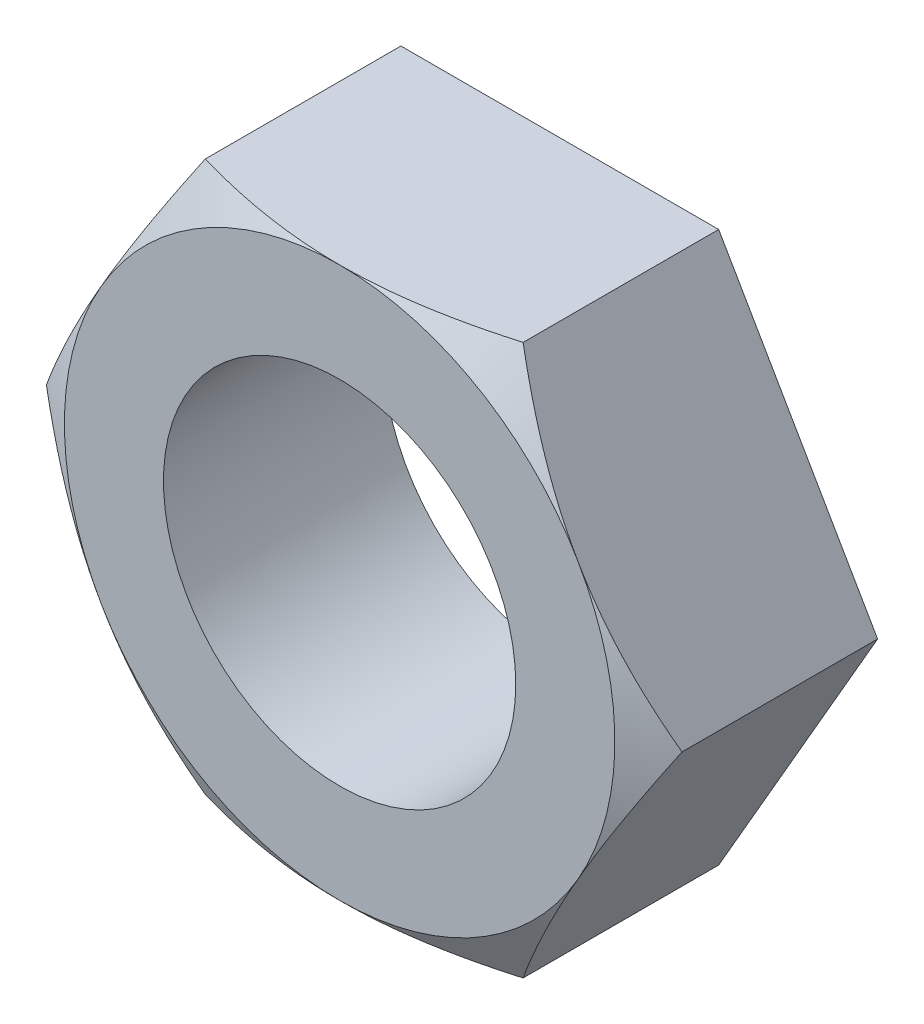
ISO-10303-21;
HEADER;
FILE_DESCRIPTION(('STEP AP214'),'2;1');
FILE_NAME('part.step','',(''),(''),'','','');
FILE_SCHEMA(('AUTOMOTIVE_DESIGN { 1 0 10303 214 1 1 1 1 }'));
ENDSEC;
DATA;
#1=APPLICATION_CONTEXT('core data for automotive mechanical design processes');
#2=APPLICATION_PROTOCOL_DEFINITION('international standard','automotive_design',2000,#1);
#3=PRODUCT_CONTEXT('',#1,'mechanical');
#4=PRODUCT('Part','Part','',(#3));
#5=PRODUCT_RELATED_PRODUCT_CATEGORY('part','',(#4));
#6=PRODUCT_DEFINITION_FORMATION('','',#4);
#7=PRODUCT_DEFINITION_CONTEXT('part definition',#1,'design');
#8=PRODUCT_DEFINITION('design','',#6,#7);
#9=PRODUCT_DEFINITION_SHAPE('','',#8);
#10=(LENGTH_UNIT() NAMED_UNIT(*) SI_UNIT(.MILLI.,.METRE.));
#11=(NAMED_UNIT(*) PLANE_ANGLE_UNIT() SI_UNIT($,.RADIAN.));
#12=(NAMED_UNIT(*) SI_UNIT($,.STERADIAN.) SOLID_ANGLE_UNIT());
#13=UNCERTAINTY_MEASURE_WITH_UNIT(LENGTH_MEASURE(1.E-05),#10,'distance_accuracy_value','');
#14=(GEOMETRIC_REPRESENTATION_CONTEXT(3) GLOBAL_UNCERTAINTY_ASSIGNED_CONTEXT((#13)) GLOBAL_UNIT_ASSIGNED_CONTEXT((#10,
#11,#12)) REPRESENTATION_CONTEXT('',''));
#15=CARTESIAN_POINT('',(0.,0.,0.));
#16=DIRECTION('',(0.,0.,1.));
#17=DIRECTION('',(1.,0.,0.));
#18=AXIS2_PLACEMENT_3D('',#15,#16,#17);
#19=CARTESIAN_POINT('',(7.21687836487047,-12.4999999999999,10.));
#20=DIRECTION('',(-0.866025403784441,0.499999999999995,0.));
#21=DIRECTION('',(-0.499999999999995,-0.866025403784441,0.));
#22=AXIS2_PLACEMENT_3D('',#19,#20,#21);
#23=PLANE('',#22);
#24=CARTESIAN_POINT('',(7.21676289481663,-12.5001999999999,8.88347836407037));
#25=CARTESIAN_POINT('',(7.37538720676169,-12.2254546323954,8.97505452339791));
#26=CARTESIAN_POINT('',(7.53463023886579,-11.9496376100398,9.06247516136619));
#27=CARTESIAN_POINT('',(7.85439324689781,-11.3957918337473,9.22785029648819));
#28=CARTESIAN_POINT('',(8.01491362441963,-11.1177623842294,9.30580168024974));
#29=CARTESIAN_POINT('',(8.33754155397065,-10.5589544183062,9.45119048700357));
#30=CARTESIAN_POINT('',(8.49965192926075,-10.2781710118697,9.51860303339904));
#31=CARTESIAN_POINT('',(8.82499915663675,-9.7146530839528,9.64146662159215));
#32=CARTESIAN_POINT('',(8.98823594390972,-9.43191867473171,9.69691834578119));
#33=CARTESIAN_POINT('',(9.31165322870549,-8.87174350541945,9.79350173205536));
#34=CARTESIAN_POINT('',(9.47180971512836,-8.59434433377331,9.83495306623979));
#35=CARTESIAN_POINT('',(9.79285656486178,-8.03827487842509,9.90445793985331));
#36=CARTESIAN_POINT('',(9.95374694223766,-7.75960457036115,9.93251122140478));
#37=CARTESIAN_POINT('',(10.2757979783547,-7.20179581317628,9.97451166013351));
#38=CARTESIAN_POINT('',(10.4369580868775,-6.92265831706134,9.98847557991425));
#39=CARTESIAN_POINT('',(10.7594270802745,-6.36412563663214,10.0019969897623));
#40=CARTESIAN_POINT('',(10.9207359603978,-6.08473046054666,10.0015549249596));
#41=CARTESIAN_POINT('',(11.2223029665878,-5.56240108393914,9.98727051925022));
#42=CARTESIAN_POINT('',(11.362582581157,-5.319429664239,9.9751705323715));
#43=CARTESIAN_POINT('',(11.642819136161,-4.8340457128341,9.94030381034694));
#44=CARTESIAN_POINT('',(11.7827760530676,-4.59163322188117,9.91753632069198));
#45=CARTESIAN_POINT('',(12.0622911922356,-4.10749879935742,9.86173156560465));
#46=CARTESIAN_POINT('',(12.2018489887703,-3.86577760516694,9.8286858180011));
#47=CARTESIAN_POINT('',(12.4803103038966,-3.38346845942574,9.75290433749108));
#48=CARTESIAN_POINT('',(12.6192137773526,-3.14288058605225,9.71016794582646));
#49=CARTESIAN_POINT('',(13.0408630466772,-2.41256262860773,9.56634247770938));
#50=CARTESIAN_POINT('',(13.3223878040513,-1.92494744524722,9.45091239646002));
#51=CARTESIAN_POINT('',(13.8812393974114,-0.956988091656618,9.18893319969111));
#52=CARTESIAN_POINT('',(14.1585733887867,-0.476631527928807,9.04244561244878));
#53=CARTESIAN_POINT('',(14.4338721997945,0.000199999999999989,8.88347836407037));
#54=B_SPLINE_CURVE_WITH_KNOTS('',3,(#24,#25,#26,#27,#28,#29,#30,#31,#32,#33,#34,#35,#36,#37,#38,
#39,#40,#41,#42,#43,#44,#45,#46,#47,#48,#49,#50,#51,#52,#53),.UNSPECIFIED.,.F.,.F.,(4,2,2,2,2,2,
2,2,2,2,2,2,2,2,4),(0.,0.990629746049023,1.9815843243025,2.97484380692451,3.96804660689563,
4.93673469695275,5.90544143098089,6.87299429712455,7.84051726691999,8.68277430917982,
9.52509093301095,10.3681045344908,11.2111754601961,12.9343924021276,14.6542268428617),.UNSPECIFIED.);
#55=CARTESIAN_POINT('',(7.21687836487052,-12.4999999999999,8.88354503153706));
#56=VERTEX_POINT('',#55);
#57=CARTESIAN_POINT('',(10.8253175473056,-6.24999999999998,10.));
#58=VERTEX_POINT('',#57);
#59=EDGE_CURVE('E228',#56,#58,#54,.T.);
#60=ORIENTED_EDGE('',*,*,#59,.F.);
#61=DIRECTION('',(0.,0.,-1.));
#62=VECTOR('',#61,1.);
#63=CARTESIAN_POINT('',(7.21687836487047,-12.4999999999999,10.));
#64=LINE('',#63,#62);
#65=CARTESIAN_POINT('',(7.21687836487047,-12.4999999999999,0.));
#66=VERTEX_POINT('',#65);
#67=EDGE_CURVE('E231',#56,#66,#64,.T.);
#68=ORIENTED_EDGE('',*,*,#67,.T.);
#69=DIRECTION('',(0.499999999999995,0.866025403784441,0.));
#70=VECTOR('',#69,1.);
#71=CARTESIAN_POINT('',(7.21687836487047,-12.4999999999999,0.));
#72=LINE('',#71,#70);
#73=CARTESIAN_POINT('',(14.4337567297407,0.,0.));
#74=VERTEX_POINT('',#73);
#75=EDGE_CURVE('E289',#66,#74,#72,.T.);
#76=ORIENTED_EDGE('',*,*,#75,.T.);
#77=DIRECTION('',(0.,0.,-1.));
#78=VECTOR('',#77,1.);
#79=CARTESIAN_POINT('',(14.4337567297407,0.,10.));
#80=LINE('',#79,#78);
#81=CARTESIAN_POINT('',(14.4337567297407,0.,8.88354503153703));
#82=VERTEX_POINT('',#81);
#83=EDGE_CURVE('E259',#82,#74,#80,.T.);
#84=ORIENTED_EDGE('',*,*,#83,.F.);
#85=EDGE_CURVE('E180',#58,#82,#54,.T.);
#86=ORIENTED_EDGE('',*,*,#85,.F.);
#87=EDGE_LOOP('',(#60,#68,#76,#84,#86));
#88=FACE_BOUND('',#87,.T.);
#89=ADVANCED_FACE('F46',(#88),#23,.F.);
#90=CARTESIAN_POINT('',(14.4337567297407,0.,10.));
#91=DIRECTION('',(-0.866025403784438,-0.500000000000001,0.));
#92=DIRECTION('',(0.500000000000001,-0.866025403784438,0.));
#93=AXIS2_PLACEMENT_3D('',#90,#91,#92);
#94=PLANE('',#93);
#95=CARTESIAN_POINT('',(14.4338721997945,-0.0002,8.88347836407037));
#96=CARTESIAN_POINT('',(14.2752478878494,0.274545367604498,8.97505452339791));
#97=CARTESIAN_POINT('',(14.1160048557453,0.550362389960127,9.06247516136619));
#98=CARTESIAN_POINT('',(13.7962418477133,1.10420816625264,9.2278502964882));
#99=CARTESIAN_POINT('',(13.6357214701915,1.38223761577056,9.30580168024975));
#100=CARTESIAN_POINT('',(13.3130935406405,1.9410455816937,9.45119048700358));
#101=CARTESIAN_POINT('',(13.1509831653504,2.2218289881302,9.51860303339905));
#102=CARTESIAN_POINT('',(12.8256359379744,2.78534691604711,9.64146662159216));
#103=CARTESIAN_POINT('',(12.6623991507014,3.0680813252682,9.6969183457812));
#104=CARTESIAN_POINT('',(12.3389818659056,3.62825649458046,9.79350173205538));
#105=CARTESIAN_POINT('',(12.1788253794827,3.90565566622659,9.83495306623981));
#106=CARTESIAN_POINT('',(11.8577785297493,4.46172512157481,9.90445793985333));
#107=CARTESIAN_POINT('',(11.6968881523734,4.74039542963875,9.9325112214048));
#108=CARTESIAN_POINT('',(11.3748371162564,5.29820418682362,9.97451166013354));
#109=CARTESIAN_POINT('',(11.2136770077336,5.57734168293856,9.98847557991428));
#110=CARTESIAN_POINT('',(10.8912080143365,6.13587436336776,10.0019969897623));
#111=CARTESIAN_POINT('',(10.7298991342133,6.41526953945323,10.0015549249596));
#112=CARTESIAN_POINT('',(10.4283321280233,6.93759891606076,9.98727051925026));
#113=CARTESIAN_POINT('',(10.288052513454,7.18057033576091,9.97517053237153));
#114=CARTESIAN_POINT('',(10.0078159584501,7.66595428716582,9.94030381034697));
#115=CARTESIAN_POINT('',(9.86785904154349,7.90836677811876,9.91753632069202));
#116=CARTESIAN_POINT('',(9.58834390237543,8.39250120064252,9.86173156560469));
#117=CARTESIAN_POINT('',(9.44878610584072,8.63422239483299,9.82868581800113));
#118=CARTESIAN_POINT('',(9.17032479071441,9.11653154057421,9.75290433749112));
#119=CARTESIAN_POINT('',(9.03142131725846,9.3571194139477,9.71016794582649));
#120=CARTESIAN_POINT('',(8.60977204793384,10.0874373713922,9.5663424777094));
#121=CARTESIAN_POINT('',(8.32824729055969,10.5750525547528,9.45091239646004));
#122=CARTESIAN_POINT('',(7.76939569719953,11.5430119083434,9.18893319969112));
#123=CARTESIAN_POINT('',(7.49206170582426,12.0233684720712,9.04244561244878));
#124=CARTESIAN_POINT('',(7.21676289481646,12.5002,8.88347836407037));
#125=B_SPLINE_CURVE_WITH_KNOTS('',3,(#95,#96,#97,#98,#99,#100,#101,#102,#103,#104,#105,#106,
#107,#108,#109,#110,#111,#112,#113,#114,#115,#116,#117,#118,#119,#120,#121,#122,#123,#124),
.UNSPECIFIED.,.F.,.F.,(4,2,2,2,2,2,2,2,2,2,2,2,2,2,4),(0.,0.990629746049023,1.9815843243025,
2.97484380692451,3.96804660689564,4.93673469695275,5.90544143098089,6.87299429712455,
7.84051726691999,8.68277430917984,9.52509093301099,10.3681045344909,11.2111754601961,
12.9343924021277,14.6542268428618),.UNSPECIFIED.);
#126=CARTESIAN_POINT('',(10.8253175473055,6.25000000000005,10.));
#127=VERTEX_POINT('',#126);
#128=EDGE_CURVE('E305',#82,#127,#125,.T.);
#129=ORIENTED_EDGE('',*,*,#128,.F.);
#130=ORIENTED_EDGE('',*,*,#83,.T.);
#131=DIRECTION('',(-0.500000000000001,0.866025403784438,0.));
#132=VECTOR('',#131,1.);
#133=CARTESIAN_POINT('',(14.4337567297407,0.,0.));
#134=LINE('',#133,#132);
#135=CARTESIAN_POINT('',(7.2168783648703,12.5,0.));
#136=VERTEX_POINT('',#135);
#137=EDGE_CURVE('E291',#74,#136,#134,.T.);
#138=ORIENTED_EDGE('',*,*,#137,.T.);
#139=DIRECTION('',(0.,0.,-1.));
#140=VECTOR('',#139,1.);
#141=CARTESIAN_POINT('',(7.2168783648703,12.5,10.));
#142=LINE('',#141,#140);
#143=CARTESIAN_POINT('',(7.2168783648703,12.5,8.88354503153703));
#144=VERTEX_POINT('',#143);
#145=EDGE_CURVE('E257',#144,#136,#142,.T.);
#146=ORIENTED_EDGE('',*,*,#145,.F.);
#147=EDGE_CURVE('E123',#127,#144,#125,.T.);
#148=ORIENTED_EDGE('',*,*,#147,.F.);
#149=EDGE_LOOP('',(#129,#130,#138,#146,#148));
#150=FACE_BOUND('',#149,.T.);
#151=ADVANCED_FACE('F218',(#150),#94,.F.);
#152=CARTESIAN_POINT('',(7.2168783648703,12.5,10.));
#153=DIRECTION('',(0.,-1.,0.));
#154=DIRECTION('',(1.,0.,0.));
#155=AXIS2_PLACEMENT_3D('',#152,#153,#154);
#156=PLANE('',#155);
#157=CARTESIAN_POINT('',(24.6735015147107,12.5000000000001,1.24782833054428));
#158=CARTESIAN_POINT('',(24.0989104155865,12.5000000000001,1.54371926000708));
#159=CARTESIAN_POINT('',(23.5234850312994,12.5000000000001,1.83800416461224));
#160=CARTESIAN_POINT('',(22.3705842102035,12.5000000000001,2.42255479245057));
#161=CARTESIAN_POINT('',(21.7931087357172,12.5000000000001,2.71282044133039));
#162=CARTESIAN_POINT('',(20.6348073186091,12.5000000000001,3.28898207534192));
#163=CARTESIAN_POINT('',(20.0539774569313,12.5000000000001,3.57487019530081));
#164=CARTESIAN_POINT('',(18.8894057820324,12.5000000000001,4.14068363772284));
#165=CARTESIAN_POINT('',(18.3056639276131,12.5000000000001,4.42060887552767));
#166=CARTESIAN_POINT('',(17.1038063087146,12.5000000000001,4.98762585126182));
#167=CARTESIAN_POINT('',(16.4855011141045,12.5000000000001,5.2743171273961));
#168=CARTESIAN_POINT('',(15.2441748859783,12.5000000000001,5.83725889327398));
#169=CARTESIAN_POINT('',(14.6211540897676,12.5,6.11350990426962));
#170=CARTESIAN_POINT('',(13.3697161250641,12.5,6.6523841758414));
#171=CARTESIAN_POINT('',(12.7413028263085,12.5,6.91501638870711));
#172=CARTESIAN_POINT('',(11.4772235436945,12.5,7.42282848997696));
#173=CARTESIAN_POINT('',(10.8415559143856,12.5,7.6680043237597));
#174=CARTESIAN_POINT('',(9.83054483815168,12.5,8.03705864610944));
#175=CARTESIAN_POINT('',(9.45800959230584,12.5,8.16862910838764));
#176=CARTESIAN_POINT('',(8.70979222121836,12.5,8.42258461566387));
#177=CARTESIAN_POINT('',(8.33410999261814,12.5,8.54496935764352));
#178=CARTESIAN_POINT('',(7.579546829421,12.5,8.77890257478272));
#179=CARTESIAN_POINT('',(7.20066733082114,12.5,8.89045565975038));
#180=CARTESIAN_POINT('',(6.43942780874309,12.5,9.10095537953575));
#181=CARTESIAN_POINT('',(6.05706802196686,12.5,9.19990286492411));
#182=CARTESIAN_POINT('',(5.29616560085059,12.5,9.38145270401208));
#183=CARTESIAN_POINT('',(4.91768918918861,12.5,9.46433073470271));
#184=CARTESIAN_POINT('',(4.15756497967754,12.5,9.61407689202486));
#185=CARTESIAN_POINT('',(3.77591725771117,12.5,9.68094540059535));
#186=CARTESIAN_POINT('',(3.0100734615234,12.5,9.79676829262587));
#187=CARTESIAN_POINT('',(2.62587869120183,12.5,9.84573121510113));
#188=CARTESIAN_POINT('',(1.85549035723466,12.5,9.92420758810907));
#189=CARTESIAN_POINT('',(1.4692968100011,12.5,9.95372119808631));
#190=CARTESIAN_POINT('',(0.690589630251769,12.5,9.99251120972135));
#191=CARTESIAN_POINT('',(0.298061754107309,12.5,10.0015055311764));
#192=CARTESIAN_POINT('',(-0.486898932917529,12.5,9.99808271448809));
#193=CARTESIAN_POINT('',(-0.879331743802788,12.5,9.98566557744462));
#194=CARTESIAN_POINT('',(-1.6630686964525,12.5,9.93988887578324));
#195=CARTESIAN_POINT('',(-2.05437249661653,12.5,9.90652352898583));
#196=CARTESIAN_POINT('',(-2.83477785481683,12.5,9.82004911546968));
#197=CARTESIAN_POINT('',(-3.22387935768152,12.5,9.76693955632545));
#198=CARTESIAN_POINT('',(-4.00698546342013,12.5,9.64144588215098));
#199=CARTESIAN_POINT('',(-4.40093070725859,12.5,9.56869467437242));
#200=CARTESIAN_POINT('',(-5.18538742328732,12.5,9.40654234090582));
#201=CARTESIAN_POINT('',(-5.57589856796749,12.5,9.31713964481818));
#202=CARTESIAN_POINT('',(-6.35336024612688,12.5,9.12383521553878));
#203=CARTESIAN_POINT('',(-6.74031016030102,12.5,9.01993100945787));
#204=CARTESIAN_POINT('',(-7.51063385102028,12.5,8.79968109175308));
#205=CARTESIAN_POINT('',(-7.89400760828441,12.5,8.68333531309207));
#206=CARTESIAN_POINT('',(-8.64284985231231,12.5,8.4446660337831));
#207=CARTESIAN_POINT('',(-9.00844500607029,12.5,8.32273787663361));
#208=CARTESIAN_POINT('',(-9.73673666776783,12.5,8.07049192081159));
#209=CARTESIAN_POINT('',(-10.0994330519286,12.5,7.94017376601135));
#210=CARTESIAN_POINT('',(-10.8222298769381,12.5,7.67235399547952));
#211=CARTESIAN_POINT('',(-11.1823298387696,12.5,7.53485109095785));
#212=CARTESIAN_POINT('',(-11.9001357525964,12.5,7.25371778206691));
#213=CARTESIAN_POINT('',(-12.2578416356164,12.5,7.11008720202622));
#214=CARTESIAN_POINT('',(-12.9714806661712,12.5,6.81742085643019));
#215=CARTESIAN_POINT('',(-13.3274114932484,12.5,6.66837944349063));
#216=CARTESIAN_POINT('',(-14.0373449964709,12.5,6.3657674942914));
#217=CARTESIAN_POINT('',(-14.3913476419935,12.5,6.21219688634775));
#218=CARTESIAN_POINT('',(-15.4506943554345,12.5,5.74568597394855));
#219=CARTESIAN_POINT('',(-16.1534694432633,12.4999999999999,5.42690836362757));
#220=CARTESIAN_POINT('',(-17.5137580258367,12.4999999999999,4.79609602506191));
#221=CARTESIAN_POINT('',(-18.1715733706921,12.4999999999999,4.48470819174538));
#222=CARTESIAN_POINT('',(-19.4833016611431,12.4999999999999,3.85377684846297));
#223=CARTESIAN_POINT('',(-20.1372144774454,12.4999999999999,3.53423307011561));
#224=CARTESIAN_POINT('',(-21.4396921355535,12.4999999999999,2.88976844368902));
#225=CARTESIAN_POINT('',(-22.0882675066643,12.4999999999999,2.56486883502219));
#226=CARTESIAN_POINT('',(-23.0591465387911,12.4999999999999,2.07367288823467));
#227=CARTESIAN_POINT('',(-23.3824289848675,12.4999999999999,1.9093066417243));
#228=CARTESIAN_POINT('',(-24.0283976366334,12.4999999999999,1.57941020042671));
#229=CARTESIAN_POINT('',(-24.3510838451012,12.4999999999999,1.4138800110806));
#230=CARTESIAN_POINT('',(-24.6735015147108,12.4999999999999,1.24782833054427));
#231=B_SPLINE_CURVE_WITH_KNOTS('',3,(#157,#158,#159,#160,#161,#162,#163,#164,#165,#166,#167,
#168,#169,#170,#171,#172,#173,#174,#175,#176,#177,#178,#179,#180,#181,#182,#183,#184,#185,#186,
#187,#188,#189,#190,#191,#192,#193,#194,#195,#196,#197,#198,#199,#200,#201,#202,#203,#204,#205,
#206,#207,#208,#209,#210,#211,#212,#213,#214,#215,#216,#217,#218,#219,#220,#221,#222,#223,#224,
#225,#226,#227,#228,#229,#230),.UNSPECIFIED.,.F.,.F.,(4,2,2,2,2,2,2,2,2,2,2,2,2,2,2,2,2,2,2,2,2,
2,2,2,2,2,2,2,2,2,2,2,2,2,2,2,4),(0.,1.93891330735769,3.87786243542343,5.81996162099387,
7.76208836126259,9.80662626001073,11.8510619457135,13.8941362314276,15.9376835275793,
17.122846961843,18.3080494750896,19.4927453506381,20.6773612457119,21.8393903736996,
23.0013917764104,24.1628383060758,25.3242753141384,26.5015848826924,27.6788943907696,
28.8565290058404,30.0341929933771,31.2356057521259,32.4371318733743,33.6388631373661,
34.8406008767986,35.9966574395805,37.1527631055426,38.3090768688087,39.465423804188,
40.6230144462245,41.7806234193952,44.0955418994832,46.2788601482065,48.4622503345899,
50.6384308857621,51.7264318591709,52.8144277498431),.UNSPECIFIED.);
#232=CARTESIAN_POINT('',(0.,12.5000000000001,10.));
#233=VERTEX_POINT('',#232);
#234=EDGE_CURVE('E119',#144,#233,#231,.T.);
#235=ORIENTED_EDGE('',*,*,#234,.F.);
#236=ORIENTED_EDGE('',*,*,#145,.T.);
#237=DIRECTION('',(-1.,0.,0.));
#238=VECTOR('',#237,1.);
#239=CARTESIAN_POINT('',(7.2168783648703,12.5,0.));
#240=LINE('',#239,#238);
#241=CARTESIAN_POINT('',(-7.21687836487038,12.5,0.));
#242=VERTEX_POINT('',#241);
#243=EDGE_CURVE('E297',#136,#242,#240,.T.);
#244=ORIENTED_EDGE('',*,*,#243,.T.);
#245=DIRECTION('',(0.,0.,-1.));
#246=VECTOR('',#245,1.);
#247=CARTESIAN_POINT('',(-7.21687836487038,12.5,10.));
#248=LINE('',#247,#246);
#249=CARTESIAN_POINT('',(-7.21687836487038,12.5,8.88354503153703));
#250=VERTEX_POINT('',#249);
#251=EDGE_CURVE('E145',#250,#242,#248,.T.);
#252=ORIENTED_EDGE('',*,*,#251,.F.);
#253=EDGE_CURVE('E128',#233,#250,#231,.T.);
#254=ORIENTED_EDGE('',*,*,#253,.F.);
#255=EDGE_LOOP('',(#235,#236,#244,#252,#254));
#256=FACE_BOUND('',#255,.T.);
#257=ADVANCED_FACE('F143',(#256),#156,.F.);
#258=CARTESIAN_POINT('',(-7.21687836487038,12.5,10.));
#259=DIRECTION('',(0.866025403784442,-0.499999999999995,0.));
#260=DIRECTION('',(0.499999999999995,0.866025403784442,0.));
#261=AXIS2_PLACEMENT_3D('',#258,#259,#260);
#262=PLANE('',#261);
#263=CARTESIAN_POINT('',(-7.21676289481655,12.5002,8.88347836407037));
#264=CARTESIAN_POINT('',(-7.37538720676161,12.2254546323955,8.97505452339791));
#265=CARTESIAN_POINT('',(-7.53463023886571,11.9496376100398,9.06247516136619));
#266=CARTESIAN_POINT('',(-7.85439324689772,11.3957918337473,9.2278502964882));
#267=CARTESIAN_POINT('',(-8.01491362441954,11.1177623842294,9.30580168024975));
#268=CARTESIAN_POINT('',(-8.33754155397056,10.5589544183063,9.45119048700358));
#269=CARTESIAN_POINT('',(-8.49965192926066,10.2781710118698,9.51860303339905));
#270=CARTESIAN_POINT('',(-8.82499915663667,9.71465308395285,9.64146662159216));
#271=CARTESIAN_POINT('',(-8.98823594390963,9.43191867473177,9.6969183457812));
#272=CARTESIAN_POINT('',(-9.3116532287054,8.8717435054195,9.79350173205538));
#273=CARTESIAN_POINT('',(-9.47180971512827,8.59434433377337,9.83495306623981));
#274=CARTESIAN_POINT('',(-9.79285656486169,8.03827487842515,9.90445793985333));
#275=CARTESIAN_POINT('',(-9.95374694223757,7.75960457036121,9.9325112214048));
#276=CARTESIAN_POINT('',(-10.2757979783546,7.20179581317634,9.97451166013354));
#277=CARTESIAN_POINT('',(-10.4369580868774,6.9226583170614,9.98847557991428));
#278=CARTESIAN_POINT('',(-10.7594270802745,6.36412563663219,10.0019969897623));
#279=CARTESIAN_POINT('',(-10.9207359603977,6.08473046054672,10.0015549249596));
#280=CARTESIAN_POINT('',(-11.2223029665877,5.56240108393919,9.98727051925026));
#281=CARTESIAN_POINT('',(-11.3625825811569,5.31942966423904,9.97517053237153));
#282=CARTESIAN_POINT('',(-11.6428191361609,4.83404571283413,9.94030381034697));
#283=CARTESIAN_POINT('',(-11.7827760530675,4.59163322188119,9.91753632069202));
#284=CARTESIAN_POINT('',(-12.0622911922356,4.10749879935743,9.86173156560468));
#285=CARTESIAN_POINT('',(-12.2018489887703,3.86577760516695,9.82868581800113));
#286=CARTESIAN_POINT('',(-12.4803103038966,3.38346845942573,9.75290433749112));
#287=CARTESIAN_POINT('',(-12.6192137773525,3.14288058605224,9.71016794582649));
#288=CARTESIAN_POINT('',(-13.0408630466771,2.41256262860769,9.5663424777094));
#289=CARTESIAN_POINT('',(-13.3223878040513,1.92494744524717,9.45091239646004));
#290=CARTESIAN_POINT('',(-13.8812393974114,0.956988091656543,9.18893319969112));
#291=CARTESIAN_POINT('',(-14.1585733887867,0.476631527928719,9.04244561244878));
#292=CARTESIAN_POINT('',(-14.4338721997945,-0.000200000000102122,8.88347836407037));
#293=B_SPLINE_CURVE_WITH_KNOTS('',3,(#263,#264,#265,#266,#267,#268,#269,#270,#271,#272,#273,
#274,#275,#276,#277,#278,#279,#280,#281,#282,#283,#284,#285,#286,#287,#288,#289,#290,#291,#292),
.UNSPECIFIED.,.F.,.F.,(4,2,2,2,2,2,2,2,2,2,2,2,2,2,4),(0.,0.990629746049024,1.98158432430251,
2.97484380692451,3.96804660689564,4.93673469695275,5.90544143098089,6.87299429712455,
7.84051726691999,8.68277430917984,9.52509093301099,10.3681045344909,11.2111754601961,
12.9343924021277,14.6542268428619),.UNSPECIFIED.);
#294=CARTESIAN_POINT('',(-10.8253175473056,6.24999999999998,10.));
#295=VERTEX_POINT('',#294);
#296=EDGE_CURVE('E133',#250,#295,#293,.T.);
#297=ORIENTED_EDGE('',*,*,#296,.F.);
#298=ORIENTED_EDGE('',*,*,#251,.T.);
#299=DIRECTION('',(-0.499999999999995,-0.866025403784441,0.));
#300=VECTOR('',#299,1.);
#301=CARTESIAN_POINT('',(-7.21687836487038,12.5,0.));
#302=LINE('',#301,#300);
#303=CARTESIAN_POINT('',(-14.4337567297407,-1.00790384542582E-13,0.));
#304=VERTEX_POINT('',#303);
#305=EDGE_CURVE('E284',#242,#304,#302,.T.);
#306=ORIENTED_EDGE('',*,*,#305,.T.);
#307=DIRECTION('',(0.,0.,-1.));
#308=VECTOR('',#307,1.);
#309=CARTESIAN_POINT('',(-14.4337567297407,-1.00790384542582E-13,10.));
#310=LINE('',#309,#308);
#311=CARTESIAN_POINT('',(-14.4337567297407,-1.00638984561158E-13,8.88354503153703));
#312=VERTEX_POINT('',#311);
#313=EDGE_CURVE('E247',#312,#304,#310,.T.);
#314=ORIENTED_EDGE('',*,*,#313,.F.);
#315=EDGE_CURVE('E148',#295,#312,#293,.T.);
#316=ORIENTED_EDGE('',*,*,#315,.F.);
#317=EDGE_LOOP('',(#297,#298,#306,#314,#316));
#318=FACE_BOUND('',#317,.T.);
#319=ADVANCED_FACE('F208',(#318),#262,.F.);
#320=CARTESIAN_POINT('',(-14.4337567297407,-1.00790384542582E-13,10.));
#321=DIRECTION('',(0.866025403784434,0.500000000000007,0.));
#322=DIRECTION('',(-0.500000000000007,0.866025403784435,0.));
#323=AXIS2_PLACEMENT_3D('',#320,#321,#322);
#324=PLANE('',#323);
#325=CARTESIAN_POINT('',(-14.4338721997945,0.000199999999899362,8.88347836407037));
#326=CARTESIAN_POINT('',(-14.2752478878494,-0.274545367604597,8.97505452339791));
#327=CARTESIAN_POINT('',(-14.1160048557453,-0.550362389960226,9.06247516136619));
#328=CARTESIAN_POINT('',(-13.7962418477133,-1.10420816625274,9.2278502964882));
#329=CARTESIAN_POINT('',(-13.6357214701915,-1.38223761577066,9.30580168024975));
#330=CARTESIAN_POINT('',(-13.3130935406404,-1.94104558169379,9.45119048700358));
#331=CARTESIAN_POINT('',(-13.1509831653503,-2.2218289881303,9.51860303339905));
#332=CARTESIAN_POINT('',(-12.8256359379743,-2.7853469160472,9.64146662159217));
#333=CARTESIAN_POINT('',(-12.6623991507014,-3.06808132526829,9.6969183457812));
#334=CARTESIAN_POINT('',(-12.3389818659056,-3.62825649458055,9.79350173205538));
#335=CARTESIAN_POINT('',(-12.1788253794827,-3.90565566622668,9.83495306623981));
#336=CARTESIAN_POINT('',(-11.8577785297493,-4.4617251215749,9.90445793985333));
#337=CARTESIAN_POINT('',(-11.6968881523734,-4.74039542963884,9.9325112214048));
#338=CARTESIAN_POINT('',(-11.3748371162564,-5.2982041868237,9.97451166013354));
#339=CARTESIAN_POINT('',(-11.2136770077335,-5.57734168293864,9.98847557991428));
#340=CARTESIAN_POINT('',(-10.8912080143365,-6.13587436336784,10.0019969897623));
#341=CARTESIAN_POINT('',(-10.7298991342133,-6.41526953945331,10.0015549249596));
#342=CARTESIAN_POINT('',(-10.4283321280233,-6.93759891606083,9.98727051925026));
#343=CARTESIAN_POINT('',(-10.288052513454,-7.18057033576098,9.97517053237153));
#344=CARTESIAN_POINT('',(-10.00781595845,-7.66595428716588,9.94030381034697));
#345=CARTESIAN_POINT('',(-9.86785904154343,-7.90836677811882,9.91753632069201));
#346=CARTESIAN_POINT('',(-9.58834390237537,-8.39250120064258,9.86173156560469));
#347=CARTESIAN_POINT('',(-9.44878610584066,-8.63422239483306,9.82868581800113));
#348=CARTESIAN_POINT('',(-9.17032479071434,-9.11653154057428,9.75290433749112));
#349=CARTESIAN_POINT('',(-9.0314213172584,-9.35711941394776,9.71016794582649));
#350=CARTESIAN_POINT('',(-8.60977204793377,-10.0874373713923,9.5663424777094));
#351=CARTESIAN_POINT('',(-8.32824729055962,-10.5750525547528,9.45091239646005));
#352=CARTESIAN_POINT('',(-7.76939569719945,-11.5430119083434,9.18893319969112));
#353=CARTESIAN_POINT('',(-7.49206170582418,-12.0233684720713,9.04244561244878));
#354=CARTESIAN_POINT('',(-7.21676289481637,-12.5002000000001,8.88347836407037));
#355=B_SPLINE_CURVE_WITH_KNOTS('',3,(#325,#326,#327,#328,#329,#330,#331,#332,#333,#334,#335,
#336,#337,#338,#339,#340,#341,#342,#343,#344,#345,#346,#347,#348,#349,#350,#351,#352,#353,#354),
.UNSPECIFIED.,.F.,.F.,(4,2,2,2,2,2,2,2,2,2,2,2,2,2,4),(0.,0.990629746049024,1.98158432430251,
2.97484380692451,3.96804660689564,4.93673469695275,5.90544143098089,6.87299429712455,
7.84051726691999,8.68277430917984,9.52509093301099,10.3681045344909,11.2111754601961,
12.9343924021277,14.6542268428618),.UNSPECIFIED.);
#356=CARTESIAN_POINT('',(-10.8253175473055,-6.25000000000013,10.));
#357=VERTEX_POINT('',#356);
#358=EDGE_CURVE('E202',#312,#357,#355,.T.);
#359=ORIENTED_EDGE('',*,*,#358,.F.);
#360=ORIENTED_EDGE('',*,*,#313,.T.);
#361=DIRECTION('',(0.500000000000007,-0.866025403784435,0.));
#362=VECTOR('',#361,1.);
#363=CARTESIAN_POINT('',(-14.4337567297407,-1.00790384542582E-13,0.));
#364=LINE('',#363,#362);
#365=CARTESIAN_POINT('',(-7.21687836487021,-12.5000000000001,0.));
#366=VERTEX_POINT('',#365);
#367=EDGE_CURVE('E249',#304,#366,#364,.T.);
#368=ORIENTED_EDGE('',*,*,#367,.T.);
#369=DIRECTION('',(0.,0.,-1.));
#370=VECTOR('',#369,1.);
#371=CARTESIAN_POINT('',(-7.21687836487021,-12.5000000000001,10.));
#372=LINE('',#371,#370);
#373=CARTESIAN_POINT('',(-7.21687836487021,-12.5000000000001,8.88354503153703));
#374=VERTEX_POINT('',#373);
#375=EDGE_CURVE('E243',#374,#366,#372,.T.);
#376=ORIENTED_EDGE('',*,*,#375,.F.);
#377=EDGE_CURVE('E195',#357,#374,#355,.T.);
#378=ORIENTED_EDGE('',*,*,#377,.F.);
#379=EDGE_LOOP('',(#359,#360,#368,#376,#378));
#380=FACE_BOUND('',#379,.T.);
#381=ADVANCED_FACE('F204',(#380),#324,.F.);
#382=CARTESIAN_POINT('',(-7.21687836487021,-12.5000000000001,10.));
#383=DIRECTION('',(0.,1.,0.));
#384=DIRECTION('',(-1.,0.,0.));
#385=AXIS2_PLACEMENT_3D('',#382,#383,#384);
#386=PLANE('',#385);
#387=CARTESIAN_POINT('',(-24.6735015147106,-12.5000000000003,1.24782833054428));
#388=CARTESIAN_POINT('',(-24.0989104155864,-12.5000000000003,1.54371926000707));
#389=CARTESIAN_POINT('',(-23.5234850312993,-12.5000000000003,1.83800416461224));
#390=CARTESIAN_POINT('',(-22.3705842102034,-12.5000000000002,2.42255479245056));
#391=CARTESIAN_POINT('',(-21.7931087357171,-12.5000000000002,2.71282044133039));
#392=CARTESIAN_POINT('',(-20.634807318609,-12.5000000000002,3.28898207534192));
#393=CARTESIAN_POINT('',(-20.0539774569312,-12.5000000000002,3.57487019530081));
#394=CARTESIAN_POINT('',(-18.8894057820323,-12.5000000000002,4.14068363772284));
#395=CARTESIAN_POINT('',(-18.305663927613,-12.5000000000002,4.42060887552767));
#396=CARTESIAN_POINT('',(-17.1038063087145,-12.5000000000002,4.98762585126182));
#397=CARTESIAN_POINT('',(-16.4855011141044,-12.5000000000002,5.27431712739611));
#398=CARTESIAN_POINT('',(-15.2441748859782,-12.5000000000002,5.83725889327398));
#399=CARTESIAN_POINT('',(-14.6211540897675,-12.5000000000002,6.11350990426962));
#400=CARTESIAN_POINT('',(-13.369716125064,-12.5000000000001,6.6523841758414));
#401=CARTESIAN_POINT('',(-12.7413028263084,-12.5000000000001,6.91501638870711));
#402=CARTESIAN_POINT('',(-11.4772235436944,-12.5000000000001,7.42282848997696));
#403=CARTESIAN_POINT('',(-10.8415559143855,-12.5000000000001,7.66800432375969));
#404=CARTESIAN_POINT('',(-9.83054483815159,-12.5000000000001,8.03705864610944));
#405=CARTESIAN_POINT('',(-9.45800959230575,-12.5000000000001,8.16862910838764));
#406=CARTESIAN_POINT('',(-8.70979222121826,-12.5000000000001,8.42258461566387));
#407=CARTESIAN_POINT('',(-8.33410999261804,-12.5000000000001,8.54496935764352));
#408=CARTESIAN_POINT('',(-7.57954682942091,-12.5000000000001,8.77890257478272));
#409=CARTESIAN_POINT('',(-7.20066733082105,-12.5000000000001,8.89045565975038));
#410=CARTESIAN_POINT('',(-6.439427808743,-12.5000000000001,9.10095537953575));
#411=CARTESIAN_POINT('',(-6.05706802196677,-12.5000000000001,9.19990286492411));
#412=CARTESIAN_POINT('',(-5.29616560085049,-12.5000000000001,9.38145270401208));
#413=CARTESIAN_POINT('',(-4.91768918918852,-12.5000000000001,9.46433073470271));
#414=CARTESIAN_POINT('',(-4.15756497967745,-12.5,9.61407689202486));
#415=CARTESIAN_POINT('',(-3.77591725771108,-12.5,9.68094540059535));
#416=CARTESIAN_POINT('',(-3.01007346152331,-12.5,9.79676829262587));
#417=CARTESIAN_POINT('',(-2.62587869120174,-12.5,9.84573121510113));
#418=CARTESIAN_POINT('',(-1.85549035723457,-12.5,9.92420758810907));
#419=CARTESIAN_POINT('',(-1.46929681000101,-12.5,9.95372119808631));
#420=CARTESIAN_POINT('',(-0.690589630251678,-12.5,9.99251120972135));
#421=CARTESIAN_POINT('',(-0.298061754107218,-12.5,10.0015055311764));
#422=CARTESIAN_POINT('',(0.48689893291762,-12.5,9.99808271448809));
#423=CARTESIAN_POINT('',(0.879331743802879,-12.5,9.98566557744462));
#424=CARTESIAN_POINT('',(1.66306869645259,-12.5,9.93988887578324));
#425=CARTESIAN_POINT('',(2.05437249661662,-12.5,9.90652352898583));
#426=CARTESIAN_POINT('',(2.83477785481692,-12.5,9.82004911546968));
#427=CARTESIAN_POINT('',(3.22387935768162,-12.5,9.76693955632545));
#428=CARTESIAN_POINT('',(4.00698546342022,-12.5,9.64144588215098));
#429=CARTESIAN_POINT('',(4.40093070725868,-12.5,9.56869467437242));
#430=CARTESIAN_POINT('',(5.18538742328741,-12.4999999999999,9.40654234090582));
#431=CARTESIAN_POINT('',(5.57589856796758,-12.4999999999999,9.31713964481818));
#432=CARTESIAN_POINT('',(6.35336024612697,-12.4999999999999,9.12383521553878));
#433=CARTESIAN_POINT('',(6.74031016030111,-12.4999999999999,9.01993100945787));
#434=CARTESIAN_POINT('',(7.51063385102037,-12.4999999999999,8.79968109175308));
#435=CARTESIAN_POINT('',(7.8940076082845,-12.4999999999999,8.68333531309207));
#436=CARTESIAN_POINT('',(8.6428498523124,-12.4999999999999,8.4446660337831));
#437=CARTESIAN_POINT('',(9.00844500607038,-12.4999999999999,8.32273787663361));
#438=CARTESIAN_POINT('',(9.73673666776792,-12.4999999999999,8.07049192081159));
#439=CARTESIAN_POINT('',(10.0994330519287,-12.4999999999999,7.94017376601135));
#440=CARTESIAN_POINT('',(10.8222298769382,-12.4999999999999,7.67235399547952));
#441=CARTESIAN_POINT('',(11.1823298387697,-12.4999999999999,7.53485109095785));
#442=CARTESIAN_POINT('',(11.9001357525965,-12.4999999999999,7.25371778206691));
#443=CARTESIAN_POINT('',(12.2578416356165,-12.4999999999999,7.11008720202622));
#444=CARTESIAN_POINT('',(12.9714806661713,-12.4999999999999,6.81742085643019));
#445=CARTESIAN_POINT('',(13.3274114932485,-12.4999999999999,6.66837944349063));
#446=CARTESIAN_POINT('',(14.0373449964709,-12.4999999999999,6.3657674942914));
#447=CARTESIAN_POINT('',(14.3913476419936,-12.4999999999998,6.21219688634775));
#448=CARTESIAN_POINT('',(15.4506943554346,-12.4999999999998,5.74568597394855));
#449=CARTESIAN_POINT('',(16.1534694432634,-12.4999999999998,5.42690836362757));
#450=CARTESIAN_POINT('',(17.5137580258368,-12.4999999999998,4.79609602506191));
#451=CARTESIAN_POINT('',(18.1715733706922,-12.4999999999998,4.48470819174537));
#452=CARTESIAN_POINT('',(19.4833016611432,-12.4999999999998,3.85377684846297));
#453=CARTESIAN_POINT('',(20.1372144774455,-12.4999999999998,3.53423307011561));
#454=CARTESIAN_POINT('',(21.4396921355535,-12.4999999999998,2.88976844368902));
#455=CARTESIAN_POINT('',(22.0882675066644,-12.4999999999998,2.56486883502219));
#456=CARTESIAN_POINT('',(23.0591465387911,-12.4999999999998,2.07367288823467));
#457=CARTESIAN_POINT('',(23.3824289848676,-12.4999999999998,1.9093066417243));
#458=CARTESIAN_POINT('',(24.0283976366334,-12.4999999999997,1.57941020042671));
#459=CARTESIAN_POINT('',(24.3510838451012,-12.4999999999997,1.4138800110806));
#460=CARTESIAN_POINT('',(24.6735015147109,-12.4999999999997,1.24782833054428));
#461=B_SPLINE_CURVE_WITH_KNOTS('',3,(#387,#388,#389,#390,#391,#392,#393,#394,#395,#396,#397,
#398,#399,#400,#401,#402,#403,#404,#405,#406,#407,#408,#409,#410,#411,#412,#413,#414,#415,#416,
#417,#418,#419,#420,#421,#422,#423,#424,#425,#426,#427,#428,#429,#430,#431,#432,#433,#434,#435,
#436,#437,#438,#439,#440,#441,#442,#443,#444,#445,#446,#447,#448,#449,#450,#451,#452,#453,#454,
#455,#456,#457,#458,#459,#460),.UNSPECIFIED.,.F.,.F.,(4,2,2,2,2,2,2,2,2,2,2,2,2,2,2,2,2,2,2,2,2,
2,2,2,2,2,2,2,2,2,2,2,2,2,2,2,4),(0.,1.93891330735769,3.87786243542343,5.81996162099387,
7.76208836126259,9.80662626001073,11.8510619457135,13.8941362314276,15.9376835275793,
17.122846961843,18.3080494750896,19.4927453506381,20.6773612457119,21.8393903736996,
23.0013917764104,24.1628383060758,25.3242753141384,26.5015848826924,27.6788943907696,
28.8565290058404,30.0341929933771,31.2356057521259,32.4371318733743,33.6388631373661,
34.8406008767986,35.9966574395805,37.1527631055426,38.3090768688087,39.465423804188,
40.6230144462245,41.7806234193952,44.0955418994832,46.2788601482065,48.4622503345899,
50.6384308857621,51.7264318591709,52.8144277498431),.UNSPECIFIED.);
#462=CARTESIAN_POINT('',(1.3220368468887E-13,-12.5,10.));
#463=VERTEX_POINT('',#462);
#464=EDGE_CURVE('E203',#374,#463,#461,.T.);
#465=ORIENTED_EDGE('',*,*,#464,.F.);
#466=ORIENTED_EDGE('',*,*,#375,.T.);
#467=DIRECTION('',(1.,0.,0.));
#468=VECTOR('',#467,1.);
#469=CARTESIAN_POINT('',(-7.21687836487021,-12.5000000000001,0.));
#470=LINE('',#469,#468);
#471=EDGE_CURVE('E240',#366,#66,#470,.T.);
#472=ORIENTED_EDGE('',*,*,#471,.T.);
#473=ORIENTED_EDGE('',*,*,#67,.F.);
#474=EDGE_CURVE('E140',#463,#56,#461,.T.);
#475=ORIENTED_EDGE('',*,*,#474,.F.);
#476=EDGE_LOOP('',(#465,#466,#472,#473,#475));
#477=FACE_BOUND('',#476,.T.);
#478=ADVANCED_FACE('F207',(#477),#386,.F.);
#479=CARTESIAN_POINT('',(0.,0.,10.));
#480=DIRECTION('',(0.,0.,1.));
#481=DIRECTION('',(1.,0.,0.));
#482=AXIS2_PLACEMENT_3D('',#479,#480,#481);
#483=PLANE('',#482);
#484=CARTESIAN_POINT('',(0.,0.,10.));
#485=DIRECTION('',(0.,0.,1.));
#486=DIRECTION('',(1.,0.,0.));
#487=AXIS2_PLACEMENT_3D('',#484,#485,#486);
#488=CIRCLE('',#487,8.);
#489=CARTESIAN_POINT('',(8.,0.,10.));
#490=VERTEX_POINT('',#489);
#491=EDGE_CURVE('E235',#490,#490,#488,.T.);
#492=ORIENTED_EDGE('',*,*,#491,.F.);
#493=EDGE_LOOP('',(#492));
#494=FACE_BOUND('',#493,.T.);
#495=CARTESIAN_POINT('',(0.,0.,10.));
#496=DIRECTION('',(0.,0.,1.));
#497=DIRECTION('',(1.,0.,0.));
#498=AXIS2_PLACEMENT_3D('',#495,#496,#497);
#499=CIRCLE('',#498,12.5000000000001);
#500=EDGE_CURVE('E50',#58,#127,#499,.T.);
#501=ORIENTED_EDGE('',*,*,#500,.T.);
#502=CARTESIAN_POINT('',(0.,0.,10.));
#503=DIRECTION('',(0.,0.,1.));
#504=DIRECTION('',(1.,0.,0.));
#505=AXIS2_PLACEMENT_3D('',#502,#503,#504);
#506=CIRCLE('',#505,12.5000000000001);
#507=EDGE_CURVE('E63',#127,#233,#506,.T.);
#508=ORIENTED_EDGE('',*,*,#507,.T.);
#509=EDGE_CURVE('E12',#233,#295,#499,.T.);
#510=ORIENTED_EDGE('',*,*,#509,.T.);
#511=EDGE_CURVE('E56',#295,#357,#499,.T.);
#512=ORIENTED_EDGE('',*,*,#511,.T.);
#513=EDGE_CURVE('E71',#357,#463,#499,.T.);
#514=ORIENTED_EDGE('',*,*,#513,.T.);
#515=EDGE_CURVE('E265',#463,#58,#499,.T.);
#516=ORIENTED_EDGE('',*,*,#515,.T.);
#517=EDGE_LOOP('',(#501,#508,#510,#512,#514,#516));
#518=FACE_BOUND('',#517,.T.);
#519=ADVANCED_FACE('F137',(#494,#518),#483,.T.);
#520=CARTESIAN_POINT('',(0.,0.,0.));
#521=DIRECTION('',(0.,0.,1.));
#522=DIRECTION('',(1.,0.,0.));
#523=AXIS2_PLACEMENT_3D('',#520,#521,#522);
#524=PLANE('',#523);
#525=CARTESIAN_POINT('',(0.,0.,0.));
#526=DIRECTION('',(0.,0.,1.));
#527=DIRECTION('',(1.,0.,0.));
#528=AXIS2_PLACEMENT_3D('',#525,#526,#527);
#529=CIRCLE('',#528,8.);
#530=CARTESIAN_POINT('',(8.,0.,0.));
#531=VERTEX_POINT('',#530);
#532=EDGE_CURVE('E293',#531,#531,#529,.T.);
#533=ORIENTED_EDGE('',*,*,#532,.T.);
#534=EDGE_LOOP('',(#533));
#535=FACE_BOUND('',#534,.T.);
#536=ORIENTED_EDGE('',*,*,#75,.F.);
#537=ORIENTED_EDGE('',*,*,#471,.F.);
#538=ORIENTED_EDGE('',*,*,#367,.F.);
#539=ORIENTED_EDGE('',*,*,#305,.F.);
#540=ORIENTED_EDGE('',*,*,#243,.F.);
#541=ORIENTED_EDGE('',*,*,#137,.F.);
#542=EDGE_LOOP('',(#536,#537,#538,#539,#540,#541));
#543=FACE_BOUND('',#542,.T.);
#544=ADVANCED_FACE('F288',(#535,#543),#524,.F.);
#545=CARTESIAN_POINT('',(0.,0.,0.));
#546=DIRECTION('',(0.,0.,1.));
#547=DIRECTION('',(1.,0.,0.));
#548=AXIS2_PLACEMENT_3D('',#545,#546,#547);
#549=CYLINDRICAL_SURFACE('',#548,8.);
#550=ORIENTED_EDGE('',*,*,#532,.F.);
#551=EDGE_LOOP('',(#550));
#552=FACE_BOUND('',#551,.T.);
#553=ORIENTED_EDGE('',*,*,#491,.T.);
#554=EDGE_LOOP('',(#553));
#555=FACE_BOUND('',#554,.T.);
#556=ADVANCED_FACE('F176',(#552,#555),#549,.F.);
#557=CARTESIAN_POINT('',(0.,0.,10.));
#558=DIRECTION('',(0.,0.,-1.));
#559=DIRECTION('',(1.,0.,0.));
#560=AXIS2_PLACEMENT_3D('',#557,#558,#559);
#561=CONICAL_SURFACE('',#560,12.5000000000001,1.0471975511966);
#562=ORIENTED_EDGE('',*,*,#85,.T.);
#563=ORIENTED_EDGE('',*,*,#128,.T.);
#564=ORIENTED_EDGE('',*,*,#500,.F.);
#565=EDGE_LOOP('',(#562,#563,#564));
#566=FACE_BOUND('',#565,.T.);
#567=ADVANCED_FACE('F174',(#566),#561,.T.);
#568=ORIENTED_EDGE('',*,*,#59,.T.);
#569=ORIENTED_EDGE('',*,*,#515,.F.);
#570=ORIENTED_EDGE('',*,*,#474,.T.);
#571=EDGE_LOOP('',(#568,#569,#570));
#572=FACE_BOUND('',#571,.T.);
#573=ADVANCED_FACE('F169',(#572),#561,.T.);
#574=ORIENTED_EDGE('',*,*,#377,.T.);
#575=ORIENTED_EDGE('',*,*,#464,.T.);
#576=ORIENTED_EDGE('',*,*,#513,.F.);
#577=EDGE_LOOP('',(#574,#575,#576));
#578=FACE_BOUND('',#577,.T.);
#579=ADVANCED_FACE('F173',(#578),#561,.T.);
#580=ORIENTED_EDGE('',*,*,#315,.T.);
#581=ORIENTED_EDGE('',*,*,#358,.T.);
#582=ORIENTED_EDGE('',*,*,#511,.F.);
#583=EDGE_LOOP('',(#580,#581,#582));
#584=FACE_BOUND('',#583,.T.);
#585=ADVANCED_FACE('F281',(#584),#561,.T.);
#586=ORIENTED_EDGE('',*,*,#253,.T.);
#587=ORIENTED_EDGE('',*,*,#296,.T.);
#588=ORIENTED_EDGE('',*,*,#509,.F.);
#589=EDGE_LOOP('',(#586,#587,#588));
#590=FACE_BOUND('',#589,.T.);
#591=ADVANCED_FACE('F131',(#590),#561,.T.);
#592=ORIENTED_EDGE('',*,*,#147,.T.);
#593=ORIENTED_EDGE('',*,*,#234,.T.);
#594=ORIENTED_EDGE('',*,*,#507,.F.);
#595=EDGE_LOOP('',(#592,#593,#594));
#596=FACE_BOUND('',#595,.T.);
#597=ADVANCED_FACE('F121',(#596),#561,.T.);
#598=CLOSED_SHELL('',(#89,#151,#257,#319,#381,#478,#519,#544,#556,#567,#573,#579,#585,#591,#597));
#599=MANIFOLD_SOLID_BREP('B2',#598);
#600=ADVANCED_BREP_SHAPE_REPRESENTATION('',(#18,#599),#14);
#601=SHAPE_DEFINITION_REPRESENTATION(#9,#600);
ENDSEC;
END-ISO-10303-21;
